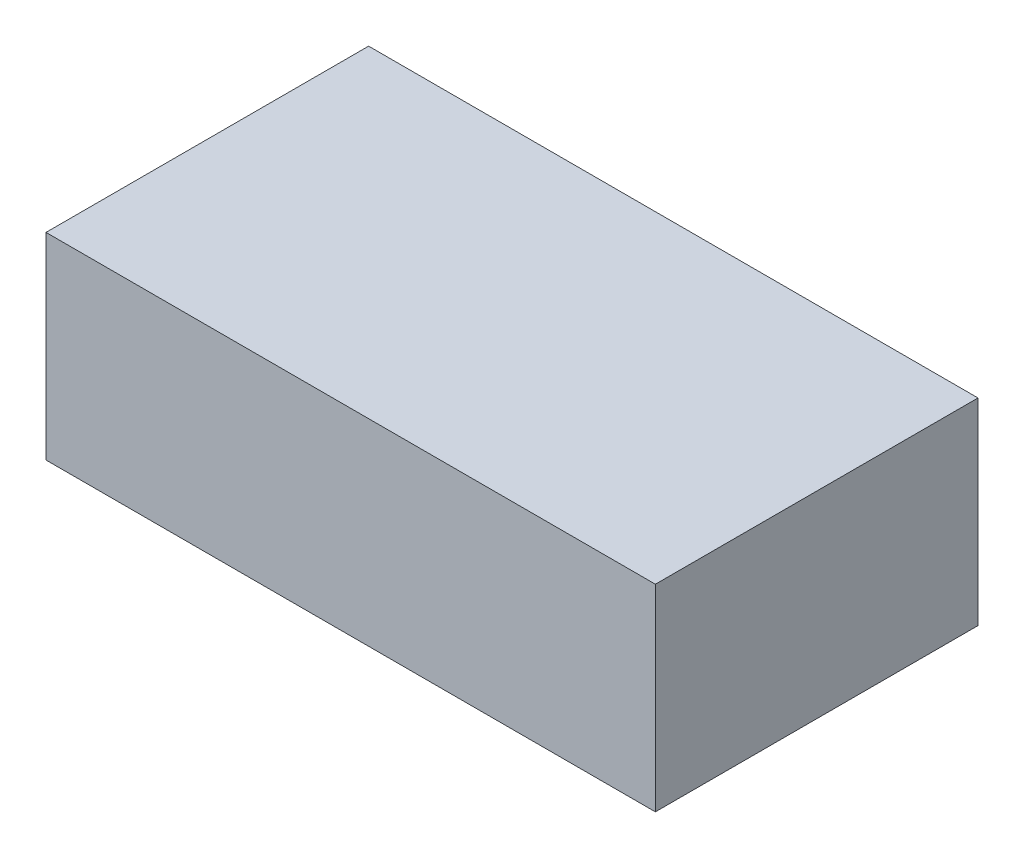
ISO-10303-21;
HEADER;
FILE_DESCRIPTION(('STEP AP214'),'2;1');
FILE_NAME('part.step','',(''),(''),'','','');
FILE_SCHEMA(('AUTOMOTIVE_DESIGN { 1 0 10303 214 1 1 1 1 }'));
ENDSEC;
DATA;
#1=APPLICATION_CONTEXT('core data for automotive mechanical design processes');
#2=APPLICATION_PROTOCOL_DEFINITION('international standard','automotive_design',2000,#1);
#3=PRODUCT_CONTEXT('',#1,'mechanical');
#4=PRODUCT('Part','Part','',(#3));
#5=PRODUCT_RELATED_PRODUCT_CATEGORY('part','',(#4));
#6=PRODUCT_DEFINITION_FORMATION('','',#4);
#7=PRODUCT_DEFINITION_CONTEXT('part definition',#1,'design');
#8=PRODUCT_DEFINITION('design','',#6,#7);
#9=PRODUCT_DEFINITION_SHAPE('','',#8);
#10=(LENGTH_UNIT() NAMED_UNIT(*) SI_UNIT(.MILLI.,.METRE.));
#11=(NAMED_UNIT(*) PLANE_ANGLE_UNIT() SI_UNIT($,.RADIAN.));
#12=(NAMED_UNIT(*) SI_UNIT($,.STERADIAN.) SOLID_ANGLE_UNIT());
#13=UNCERTAINTY_MEASURE_WITH_UNIT(LENGTH_MEASURE(1.E-05),#10,'distance_accuracy_value','');
#14=(GEOMETRIC_REPRESENTATION_CONTEXT(3) GLOBAL_UNCERTAINTY_ASSIGNED_CONTEXT((#13)) GLOBAL_UNIT_ASSIGNED_CONTEXT((#10,
#11,#12)) REPRESENTATION_CONTEXT('',''));
#15=CARTESIAN_POINT('',(0.,0.,0.));
#16=DIRECTION('',(0.,0.,1.));
#17=DIRECTION('',(1.,0.,0.));
#18=AXIS2_PLACEMENT_3D('',#15,#16,#17);
#19=CARTESIAN_POINT('',(3.,28.,-23.));
#20=DIRECTION('',(1.,0.,0.));
#21=DIRECTION('',(0.,0.,-1.));
#22=AXIS2_PLACEMENT_3D('',#19,#20,#21);
#23=PLANE('',#22);
#24=DIRECTION('',(0.,0.,1.));
#25=VECTOR('',#24,1.);
#26=CARTESIAN_POINT('',(3.,17.,-23.));
#27=LINE('',#26,#25);
#28=CARTESIAN_POINT('',(3.,17.,-23.));
#29=VERTEX_POINT('',#28);
#30=CARTESIAN_POINT('',(3.,17.,-5.));
#31=VERTEX_POINT('',#30);
#32=EDGE_CURVE('E104',#29,#31,#27,.T.);
#33=ORIENTED_EDGE('',*,*,#32,.T.);
#34=DIRECTION('',(0.,-1.,0.));
#35=VECTOR('',#34,1.);
#36=CARTESIAN_POINT('',(3.,28.,-5.));
#37=LINE('',#36,#35);
#38=CARTESIAN_POINT('',(3.,28.,-5.));
#39=VERTEX_POINT('',#38);
#40=EDGE_CURVE('E11',#39,#31,#37,.T.);
#41=ORIENTED_EDGE('',*,*,#40,.F.);
#42=DIRECTION('',(0.,0.,1.));
#43=VECTOR('',#42,1.);
#44=CARTESIAN_POINT('',(3.,28.,-23.));
#45=LINE('',#44,#43);
#46=CARTESIAN_POINT('',(3.,28.,-23.));
#47=VERTEX_POINT('',#46);
#48=EDGE_CURVE('E92',#47,#39,#45,.T.);
#49=ORIENTED_EDGE('',*,*,#48,.F.);
#50=DIRECTION('',(0.,-1.,0.));
#51=VECTOR('',#50,1.);
#52=CARTESIAN_POINT('',(3.,28.,-23.));
#53=LINE('',#52,#51);
#54=EDGE_CURVE('E100',#47,#29,#53,.T.);
#55=ORIENTED_EDGE('',*,*,#54,.T.);
#56=EDGE_LOOP('',(#33,#41,#49,#55));
#57=FACE_BOUND('',#56,.T.);
#58=ADVANCED_FACE('F41',(#57),#23,.F.);
#59=CARTESIAN_POINT('',(3.,28.,-5.));
#60=DIRECTION('',(0.,0.,-1.));
#61=DIRECTION('',(-1.,0.,0.));
#62=AXIS2_PLACEMENT_3D('',#59,#60,#61);
#63=PLANE('',#62);
#64=DIRECTION('',(1.,0.,0.));
#65=VECTOR('',#64,1.);
#66=CARTESIAN_POINT('',(3.,17.,-5.));
#67=LINE('',#66,#65);
#68=CARTESIAN_POINT('',(37.,17.,-5.));
#69=VERTEX_POINT('',#68);
#70=EDGE_CURVE('E96',#31,#69,#67,.T.);
#71=ORIENTED_EDGE('',*,*,#70,.T.);
#72=DIRECTION('',(0.,-1.,0.));
#73=VECTOR('',#72,1.);
#74=CARTESIAN_POINT('',(37.,28.,-5.));
#75=LINE('',#74,#73);
#76=CARTESIAN_POINT('',(37.,28.,-5.));
#77=VERTEX_POINT('',#76);
#78=EDGE_CURVE('E49',#77,#69,#75,.T.);
#79=ORIENTED_EDGE('',*,*,#78,.F.);
#80=DIRECTION('',(1.,0.,0.));
#81=VECTOR('',#80,1.);
#82=CARTESIAN_POINT('',(3.,28.,-5.));
#83=LINE('',#82,#81);
#84=EDGE_CURVE('E87',#39,#77,#83,.T.);
#85=ORIENTED_EDGE('',*,*,#84,.F.);
#86=ORIENTED_EDGE('',*,*,#40,.T.);
#87=EDGE_LOOP('',(#71,#79,#85,#86));
#88=FACE_BOUND('',#87,.T.);
#89=ADVANCED_FACE('F95',(#88),#63,.F.);
#90=CARTESIAN_POINT('',(37.,28.,-5.));
#91=DIRECTION('',(-1.,0.,0.));
#92=DIRECTION('',(0.,0.,1.));
#93=AXIS2_PLACEMENT_3D('',#90,#91,#92);
#94=PLANE('',#93);
#95=DIRECTION('',(0.,0.,-1.));
#96=VECTOR('',#95,1.);
#97=CARTESIAN_POINT('',(37.,17.,-5.));
#98=LINE('',#97,#96);
#99=CARTESIAN_POINT('',(37.,17.,-23.));
#100=VERTEX_POINT('',#99);
#101=EDGE_CURVE('E74',#69,#100,#98,.T.);
#102=ORIENTED_EDGE('',*,*,#101,.T.);
#103=DIRECTION('',(0.,-1.,0.));
#104=VECTOR('',#103,1.);
#105=CARTESIAN_POINT('',(37.,28.,-23.));
#106=LINE('',#105,#104);
#107=CARTESIAN_POINT('',(37.,28.,-23.));
#108=VERTEX_POINT('',#107);
#109=EDGE_CURVE('E97',#108,#100,#106,.T.);
#110=ORIENTED_EDGE('',*,*,#109,.F.);
#111=DIRECTION('',(0.,0.,-1.));
#112=VECTOR('',#111,1.);
#113=CARTESIAN_POINT('',(37.,28.,-5.));
#114=LINE('',#113,#112);
#115=EDGE_CURVE('E90',#77,#108,#114,.T.);
#116=ORIENTED_EDGE('',*,*,#115,.F.);
#117=ORIENTED_EDGE('',*,*,#78,.T.);
#118=EDGE_LOOP('',(#102,#110,#116,#117));
#119=FACE_BOUND('',#118,.T.);
#120=ADVANCED_FACE('F98',(#119),#94,.F.);
#121=CARTESIAN_POINT('',(37.,28.,-23.));
#122=DIRECTION('',(0.,0.,1.));
#123=DIRECTION('',(1.,0.,0.));
#124=AXIS2_PLACEMENT_3D('',#121,#122,#123);
#125=PLANE('',#124);
#126=DIRECTION('',(-1.,0.,0.));
#127=VECTOR('',#126,1.);
#128=CARTESIAN_POINT('',(37.,17.,-23.));
#129=LINE('',#128,#127);
#130=EDGE_CURVE('E80',#100,#29,#129,.T.);
#131=ORIENTED_EDGE('',*,*,#130,.T.);
#132=ORIENTED_EDGE('',*,*,#54,.F.);
#133=DIRECTION('',(-1.,0.,0.));
#134=VECTOR('',#133,1.);
#135=CARTESIAN_POINT('',(37.,28.,-23.));
#136=LINE('',#135,#134);
#137=EDGE_CURVE('E57',#108,#47,#136,.T.);
#138=ORIENTED_EDGE('',*,*,#137,.F.);
#139=ORIENTED_EDGE('',*,*,#109,.T.);
#140=EDGE_LOOP('',(#131,#132,#138,#139));
#141=FACE_BOUND('',#140,.T.);
#142=ADVANCED_FACE('F111',(#141),#125,.F.);
#143=CARTESIAN_POINT('',(0.,28.,0.));
#144=DIRECTION('',(0.,1.,0.));
#145=DIRECTION('',(0.,0.,1.));
#146=AXIS2_PLACEMENT_3D('',#143,#144,#145);
#147=PLANE('',#146);
#148=ORIENTED_EDGE('',*,*,#48,.T.);
#149=ORIENTED_EDGE('',*,*,#84,.T.);
#150=ORIENTED_EDGE('',*,*,#115,.T.);
#151=ORIENTED_EDGE('',*,*,#137,.T.);
#152=EDGE_LOOP('',(#148,#149,#150,#151));
#153=FACE_BOUND('',#152,.T.);
#154=ADVANCED_FACE('F88',(#153),#147,.T.);
#155=CARTESIAN_POINT('',(0.,17.,0.));
#156=DIRECTION('',(0.,1.,0.));
#157=DIRECTION('',(0.,0.,1.));
#158=AXIS2_PLACEMENT_3D('',#155,#156,#157);
#159=PLANE('',#158);
#160=ORIENTED_EDGE('',*,*,#32,.F.);
#161=ORIENTED_EDGE('',*,*,#130,.F.);
#162=ORIENTED_EDGE('',*,*,#101,.F.);
#163=ORIENTED_EDGE('',*,*,#70,.F.);
#164=EDGE_LOOP('',(#160,#161,#162,#163));
#165=FACE_BOUND('',#164,.T.);
#166=ADVANCED_FACE('F114',(#165),#159,.F.);
#167=CLOSED_SHELL('',(#58,#89,#120,#142,#154,#166));
#168=MANIFOLD_SOLID_BREP('B2',#167);
#169=ADVANCED_BREP_SHAPE_REPRESENTATION('',(#18,#168),#14);
#170=SHAPE_DEFINITION_REPRESENTATION(#9,#169);
ENDSEC;
END-ISO-10303-21;
